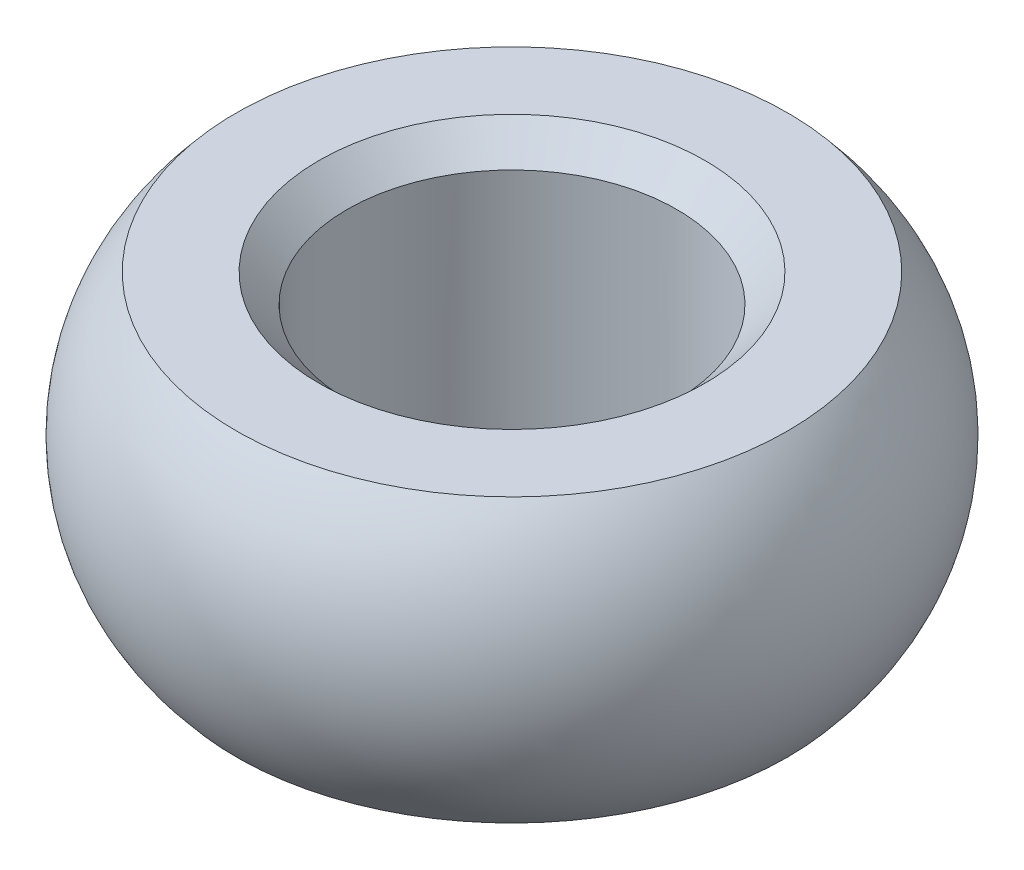
ISO-10303-21;
HEADER;
FILE_DESCRIPTION(('STEP AP214'),'2;1');
FILE_NAME('part.step','',(''),(''),'','','');
FILE_SCHEMA(('AUTOMOTIVE_DESIGN { 1 0 10303 214 1 1 1 1 }'));
ENDSEC;
DATA;
#1=APPLICATION_CONTEXT('core data for automotive mechanical design processes');
#2=APPLICATION_PROTOCOL_DEFINITION('international standard','automotive_design',2000,#1);
#3=PRODUCT_CONTEXT('',#1,'mechanical');
#4=PRODUCT('Part','Part','',(#3));
#5=PRODUCT_RELATED_PRODUCT_CATEGORY('part','',(#4));
#6=PRODUCT_DEFINITION_FORMATION('','',#4);
#7=PRODUCT_DEFINITION_CONTEXT('part definition',#1,'design');
#8=PRODUCT_DEFINITION('design','',#6,#7);
#9=PRODUCT_DEFINITION_SHAPE('','',#8);
#10=(LENGTH_UNIT() NAMED_UNIT(*) SI_UNIT(.MILLI.,.METRE.));
#11=(NAMED_UNIT(*) PLANE_ANGLE_UNIT() SI_UNIT($,.RADIAN.));
#12=(NAMED_UNIT(*) SI_UNIT($,.STERADIAN.) SOLID_ANGLE_UNIT());
#13=UNCERTAINTY_MEASURE_WITH_UNIT(LENGTH_MEASURE(1.E-05),#10,'distance_accuracy_value','');
#14=(GEOMETRIC_REPRESENTATION_CONTEXT(3) GLOBAL_UNCERTAINTY_ASSIGNED_CONTEXT((#13)) GLOBAL_UNIT_ASSIGNED_CONTEXT((#10,
#11,#12)) REPRESENTATION_CONTEXT('',''));
#15=CARTESIAN_POINT('',(0.,0.,0.));
#16=DIRECTION('',(0.,0.,1.));
#17=DIRECTION('',(1.,0.,0.));
#18=AXIS2_PLACEMENT_3D('',#15,#16,#17);
#19=CARTESIAN_POINT('',(0.,0.,0.));
#20=DIRECTION('',(0.,-1.,0.));
#21=DIRECTION('',(1.,0.,0.));
#22=AXIS2_PLACEMENT_3D('',#19,#20,#21);
#23=DEGENERATE_TOROIDAL_SURFACE('',#22,12.5,22.5,.T.);
#24=CARTESIAN_POINT('',(0.,14.9999999999999,0.));
#25=DIRECTION('',(0.,-1.,0.));
#26=DIRECTION('',(1.,0.,0.));
#27=AXIS2_PLACEMENT_3D('',#24,#25,#26);
#28=CIRCLE('',#27,29.2705098312485);
#29=CARTESIAN_POINT('',(29.2705098312484,15.,0.));
#30=VERTEX_POINT('',#29);
#31=EDGE_CURVE('E57',#30,#30,#28,.T.);
#32=ORIENTED_EDGE('',*,*,#31,.T.);
#33=EDGE_LOOP('',(#32));
#34=FACE_BOUND('',#33,.T.);
#35=CARTESIAN_POINT('',(0.,-15.0000000000001,0.));
#36=DIRECTION('',(0.,-1.,0.));
#37=DIRECTION('',(1.,0.,0.));
#38=AXIS2_PLACEMENT_3D('',#35,#36,#37);
#39=CIRCLE('',#38,29.2705098312483);
#40=CARTESIAN_POINT('',(29.2705098312484,-15.,0.));
#41=VERTEX_POINT('',#40);
#42=EDGE_CURVE('E54',#41,#41,#39,.T.);
#43=ORIENTED_EDGE('',*,*,#42,.F.);
#44=EDGE_LOOP('',(#43));
#45=FACE_BOUND('',#44,.T.);
#46=ADVANCED_FACE('F33',(#34,#45),#23,.T.);
#47=CARTESIAN_POINT('',(17.5,-15.,0.));
#48=DIRECTION('',(0.,-1.,0.));
#49=DIRECTION('',(1.,0.,0.));
#50=AXIS2_PLACEMENT_3D('',#47,#48,#49);
#51=PLANE('',#50);
#52=CARTESIAN_POINT('',(0.,-15.0000000000001,0.));
#53=DIRECTION('',(0.,-1.,0.));
#54=DIRECTION('',(1.,0.,0.));
#55=AXIS2_PLACEMENT_3D('',#52,#53,#54);
#56=CIRCLE('',#55,20.5);
#57=CARTESIAN_POINT('',(20.5000000000001,-15.,0.));
#58=VERTEX_POINT('',#57);
#59=EDGE_CURVE('E10',#58,#58,#56,.F.);
#60=ORIENTED_EDGE('',*,*,#59,.T.);
#61=EDGE_LOOP('',(#60));
#62=FACE_BOUND('',#61,.T.);
#63=ORIENTED_EDGE('',*,*,#42,.T.);
#64=EDGE_LOOP('',(#63));
#65=FACE_BOUND('',#64,.T.);
#66=ADVANCED_FACE('F75',(#62,#65),#51,.T.);
#67=CARTESIAN_POINT('',(1.65554059004424E-12,-482.629858818413,0.));
#68=DIRECTION('',(0.,-1.,0.));
#69=DIRECTION('',(1.,0.,0.));
#70=AXIS2_PLACEMENT_3D('',#67,#68,#69);
#71=CYLINDRICAL_SURFACE('',#70,17.5);
#72=CARTESIAN_POINT('',(0.,11.9999999999998,0.));
#73=DIRECTION('',(0.,1.,0.));
#74=DIRECTION('',(-1.,0.,0.));
#75=AXIS2_PLACEMENT_3D('',#72,#73,#74);
#76=CIRCLE('',#75,17.5);
#77=CARTESIAN_POINT('',(-17.5000000000001,11.9999999999998,0.));
#78=VERTEX_POINT('',#77);
#79=EDGE_CURVE('E41',#78,#78,#76,.T.);
#80=ORIENTED_EDGE('',*,*,#79,.T.);
#81=EDGE_LOOP('',(#80));
#82=FACE_BOUND('',#81,.T.);
#83=CARTESIAN_POINT('',(0.,-12.0000000000001,0.));
#84=DIRECTION('',(0.,-1.,0.));
#85=DIRECTION('',(1.,0.,0.));
#86=AXIS2_PLACEMENT_3D('',#83,#84,#85);
#87=CIRCLE('',#86,17.5);
#88=CARTESIAN_POINT('',(17.5000000000001,-12.0000000000001,0.));
#89=VERTEX_POINT('',#88);
#90=EDGE_CURVE('E45',#89,#89,#87,.T.);
#91=ORIENTED_EDGE('',*,*,#90,.T.);
#92=EDGE_LOOP('',(#91));
#93=FACE_BOUND('',#92,.T.);
#94=ADVANCED_FACE('F66',(#82,#93),#71,.F.);
#95=CARTESIAN_POINT('',(29.2705098312484,15.,0.));
#96=DIRECTION('',(0.,1.,0.));
#97=DIRECTION('',(-1.,0.,0.));
#98=AXIS2_PLACEMENT_3D('',#95,#96,#97);
#99=PLANE('',#98);
#100=CARTESIAN_POINT('',(0.,14.9999999999999,0.));
#101=DIRECTION('',(0.,1.,0.));
#102=DIRECTION('',(-1.,0.,0.));
#103=AXIS2_PLACEMENT_3D('',#100,#101,#102);
#104=CIRCLE('',#103,20.5000000000001);
#105=CARTESIAN_POINT('',(-20.5000000000001,14.9999999999998,0.));
#106=VERTEX_POINT('',#105);
#107=EDGE_CURVE('E49',#106,#106,#104,.F.);
#108=ORIENTED_EDGE('',*,*,#107,.T.);
#109=EDGE_LOOP('',(#108));
#110=FACE_BOUND('',#109,.T.);
#111=ORIENTED_EDGE('',*,*,#31,.F.);
#112=EDGE_LOOP('',(#111));
#113=FACE_BOUND('',#112,.T.);
#114=ADVANCED_FACE('F63',(#110,#113),#99,.T.);
#115=CARTESIAN_POINT('',(0.,14.9999999999999,0.));
#116=DIRECTION('',(0.,1.,0.));
#117=DIRECTION('',(-1.,0.,0.));
#118=AXIS2_PLACEMENT_3D('',#115,#116,#117);
#119=CONICAL_SURFACE('',#118,20.5,0.785398163397442);
#120=ORIENTED_EDGE('',*,*,#79,.F.);
#121=EDGE_LOOP('',(#120));
#122=FACE_BOUND('',#121,.T.);
#123=ORIENTED_EDGE('',*,*,#107,.F.);
#124=EDGE_LOOP('',(#123));
#125=FACE_BOUND('',#124,.T.);
#126=ADVANCED_FACE('F65',(#122,#125),#119,.F.);
#127=CARTESIAN_POINT('',(0.,-12.0000000000001,0.));
#128=DIRECTION('',(0.,-1.,0.));
#129=DIRECTION('',(1.,0.,0.));
#130=AXIS2_PLACEMENT_3D('',#127,#128,#129);
#131=CONICAL_SURFACE('',#130,17.5,0.785398163397458);
#132=ORIENTED_EDGE('',*,*,#59,.F.);
#133=EDGE_LOOP('',(#132));
#134=FACE_BOUND('',#133,.T.);
#135=ORIENTED_EDGE('',*,*,#90,.F.);
#136=EDGE_LOOP('',(#135));
#137=FACE_BOUND('',#136,.T.);
#138=ADVANCED_FACE('F36',(#134,#137),#131,.F.);
#139=CLOSED_SHELL('',(#46,#66,#94,#114,#126,#138));
#140=MANIFOLD_SOLID_BREP('B2',#139);
#141=ADVANCED_BREP_SHAPE_REPRESENTATION('',(#18,#140),#14);
#142=SHAPE_DEFINITION_REPRESENTATION(#9,#141);
ENDSEC;
END-ISO-10303-21;
